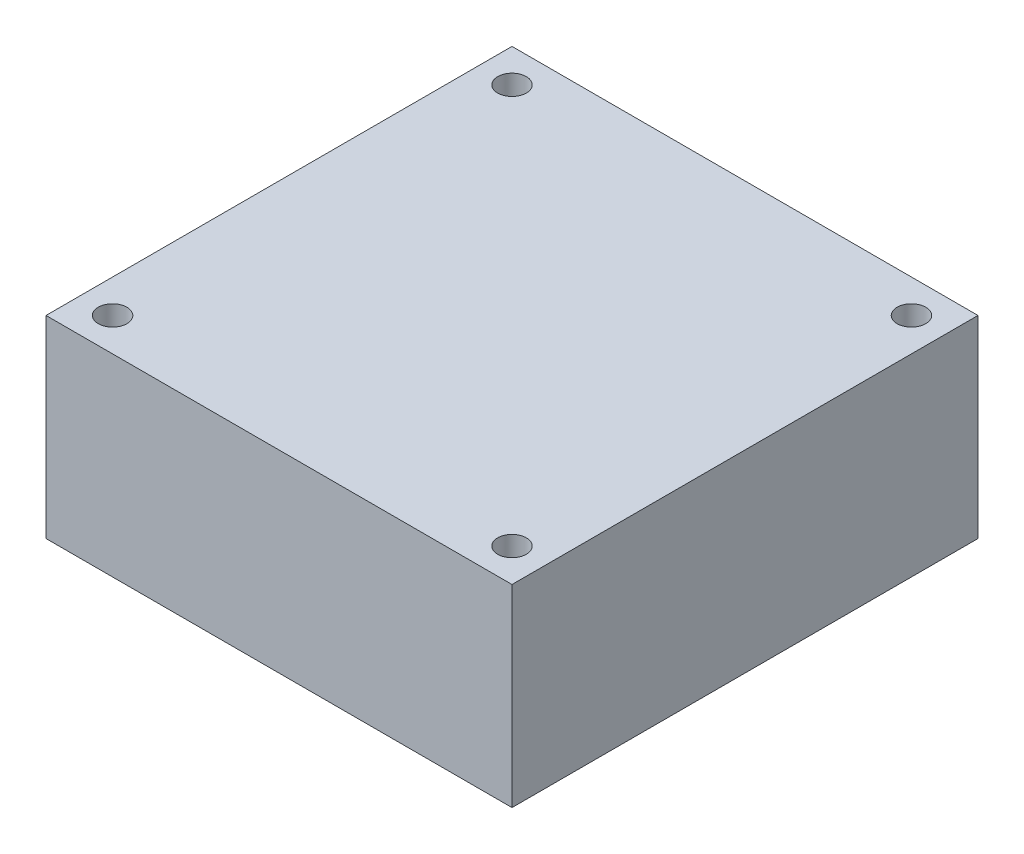
ISO-10303-21;
HEADER;
FILE_DESCRIPTION(('STEP AP214'),'2;1');
FILE_NAME('part.step','',(''),(''),'','','');
FILE_SCHEMA(('AUTOMOTIVE_DESIGN { 1 0 10303 214 1 1 1 1 }'));
ENDSEC;
DATA;
#1=APPLICATION_CONTEXT('core data for automotive mechanical design processes');
#2=APPLICATION_PROTOCOL_DEFINITION('international standard','automotive_design',2000,#1);
#3=PRODUCT_CONTEXT('',#1,'mechanical');
#4=PRODUCT('Part','Part','',(#3));
#5=PRODUCT_RELATED_PRODUCT_CATEGORY('part','',(#4));
#6=PRODUCT_DEFINITION_FORMATION('','',#4);
#7=PRODUCT_DEFINITION_CONTEXT('part definition',#1,'design');
#8=PRODUCT_DEFINITION('design','',#6,#7);
#9=PRODUCT_DEFINITION_SHAPE('','',#8);
#10=(LENGTH_UNIT() NAMED_UNIT(*) SI_UNIT(.MILLI.,.METRE.));
#11=(NAMED_UNIT(*) PLANE_ANGLE_UNIT() SI_UNIT($,.RADIAN.));
#12=(NAMED_UNIT(*) SI_UNIT($,.STERADIAN.) SOLID_ANGLE_UNIT());
#13=UNCERTAINTY_MEASURE_WITH_UNIT(LENGTH_MEASURE(1.E-05),#10,'distance_accuracy_value','');
#14=(GEOMETRIC_REPRESENTATION_CONTEXT(3) GLOBAL_UNCERTAINTY_ASSIGNED_CONTEXT((#13)) GLOBAL_UNIT_ASSIGNED_CONTEXT((#10,
#11,#12)) REPRESENTATION_CONTEXT('',''));
#15=CARTESIAN_POINT('',(0.,0.,0.));
#16=DIRECTION('',(0.,0.,1.));
#17=DIRECTION('',(1.,0.,0.));
#18=AXIS2_PLACEMENT_3D('',#15,#16,#17);
#19=CARTESIAN_POINT('',(0.,29.025,0.));
#20=DIRECTION('',(0.,-1.,0.));
#21=DIRECTION('',(0.,0.,-1.));
#22=AXIS2_PLACEMENT_3D('',#19,#20,#21);
#23=PLANE('',#22);
#24=DIRECTION('',(0.,0.,-1.));
#25=VECTOR('',#24,1.);
#26=CARTESIAN_POINT('',(35.,29.025,35.));
#27=LINE('',#26,#25);
#28=CARTESIAN_POINT('',(35.,29.025,35.));
#29=VERTEX_POINT('',#28);
#30=CARTESIAN_POINT('',(35.,29.025,-35.));
#31=VERTEX_POINT('',#30);
#32=EDGE_CURVE('E98',#29,#31,#27,.T.);
#33=ORIENTED_EDGE('',*,*,#32,.T.);
#34=DIRECTION('',(-1.,0.,0.));
#35=VECTOR('',#34,1.);
#36=CARTESIAN_POINT('',(-35.,29.025,-35.));
#37=LINE('',#36,#35);
#38=CARTESIAN_POINT('',(-35.,29.025,-35.));
#39=VERTEX_POINT('',#38);
#40=EDGE_CURVE('E93',#31,#39,#37,.T.);
#41=ORIENTED_EDGE('',*,*,#40,.T.);
#42=DIRECTION('',(0.,0.,1.));
#43=VECTOR('',#42,1.);
#44=CARTESIAN_POINT('',(-35.,29.025,35.));
#45=LINE('',#44,#43);
#46=CARTESIAN_POINT('',(-35.,29.025,35.));
#47=VERTEX_POINT('',#46);
#48=EDGE_CURVE('E96',#39,#47,#45,.T.);
#49=ORIENTED_EDGE('',*,*,#48,.T.);
#50=DIRECTION('',(1.,0.,0.));
#51=VECTOR('',#50,1.);
#52=CARTESIAN_POINT('',(-35.,29.025,35.));
#53=LINE('',#52,#51);
#54=EDGE_CURVE('E63',#47,#29,#53,.T.);
#55=ORIENTED_EDGE('',*,*,#54,.T.);
#56=EDGE_LOOP('',(#33,#41,#49,#55));
#57=FACE_BOUND('',#56,.T.);
#58=CARTESIAN_POINT('',(30.,29.025,-30.));
#59=DIRECTION('',(0.,1.,0.));
#60=DIRECTION('',(0.,0.,1.));
#61=AXIS2_PLACEMENT_3D('',#58,#59,#60);
#62=CIRCLE('',#61,2.15);
#63=CARTESIAN_POINT('',(30.,29.025,-32.15));
#64=VERTEX_POINT('',#63);
#65=EDGE_CURVE('E118',#64,#64,#62,.T.);
#66=ORIENTED_EDGE('',*,*,#65,.F.);
#67=EDGE_LOOP('',(#66));
#68=FACE_BOUND('',#67,.T.);
#69=CARTESIAN_POINT('',(-30.,29.025,-30.));
#70=DIRECTION('',(0.,1.,0.));
#71=DIRECTION('',(0.,0.,-1.));
#72=AXIS2_PLACEMENT_3D('',#69,#70,#71);
#73=CIRCLE('',#72,2.15);
#74=CARTESIAN_POINT('',(-30.,29.025,-32.15));
#75=VERTEX_POINT('',#74);
#76=EDGE_CURVE('E140',#75,#75,#73,.T.);
#77=ORIENTED_EDGE('',*,*,#76,.F.);
#78=EDGE_LOOP('',(#77));
#79=FACE_BOUND('',#78,.T.);
#80=CARTESIAN_POINT('',(-30.,29.025,30.));
#81=DIRECTION('',(0.,1.,0.));
#82=DIRECTION('',(0.,0.,1.));
#83=AXIS2_PLACEMENT_3D('',#80,#81,#82);
#84=CIRCLE('',#83,2.15);
#85=CARTESIAN_POINT('',(-30.,29.025,27.85));
#86=VERTEX_POINT('',#85);
#87=EDGE_CURVE('E148',#86,#86,#84,.T.);
#88=ORIENTED_EDGE('',*,*,#87,.F.);
#89=EDGE_LOOP('',(#88));
#90=FACE_BOUND('',#89,.T.);
#91=CARTESIAN_POINT('',(30.,29.025,30.));
#92=DIRECTION('',(0.,1.,0.));
#93=DIRECTION('',(0.,0.,-1.));
#94=AXIS2_PLACEMENT_3D('',#91,#92,#93);
#95=CIRCLE('',#94,2.15000000000001);
#96=CARTESIAN_POINT('',(30.,29.025,27.85));
#97=VERTEX_POINT('',#96);
#98=EDGE_CURVE('E156',#97,#97,#95,.T.);
#99=ORIENTED_EDGE('',*,*,#98,.F.);
#100=EDGE_LOOP('',(#99));
#101=FACE_BOUND('',#100,.T.);
#102=ADVANCED_FACE('F45',(#57,#68,#79,#90,#101),#23,.F.);
#103=CARTESIAN_POINT('',(0.,0.,0.));
#104=DIRECTION('',(0.,-1.,0.));
#105=DIRECTION('',(0.,0.,-1.));
#106=AXIS2_PLACEMENT_3D('',#103,#104,#105);
#107=PLANE('',#106);
#108=CARTESIAN_POINT('',(-30.,0.,30.));
#109=DIRECTION('',(0.,1.,0.));
#110=DIRECTION('',(0.,0.,1.));
#111=AXIS2_PLACEMENT_3D('',#108,#109,#110);
#112=CIRCLE('',#111,2.15);
#113=CARTESIAN_POINT('',(-30.,0.,27.85));
#114=VERTEX_POINT('',#113);
#115=EDGE_CURVE('E152',#114,#114,#112,.T.);
#116=ORIENTED_EDGE('',*,*,#115,.T.);
#117=EDGE_LOOP('',(#116));
#118=FACE_BOUND('',#117,.T.);
#119=CARTESIAN_POINT('',(30.,0.,-30.));
#120=DIRECTION('',(0.,1.,0.));
#121=DIRECTION('',(0.,0.,1.));
#122=AXIS2_PLACEMENT_3D('',#119,#120,#121);
#123=CIRCLE('',#122,2.15);
#124=CARTESIAN_POINT('',(30.,0.,-32.15));
#125=VERTEX_POINT('',#124);
#126=EDGE_CURVE('E136',#125,#125,#123,.T.);
#127=ORIENTED_EDGE('',*,*,#126,.T.);
#128=EDGE_LOOP('',(#127));
#129=FACE_BOUND('',#128,.T.);
#130=DIRECTION('',(0.,0.,-1.));
#131=VECTOR('',#130,1.);
#132=CARTESIAN_POINT('',(35.,0.,35.));
#133=LINE('',#132,#131);
#134=CARTESIAN_POINT('',(35.,0.,35.));
#135=VERTEX_POINT('',#134);
#136=CARTESIAN_POINT('',(35.,0.,-35.));
#137=VERTEX_POINT('',#136);
#138=EDGE_CURVE('E114',#135,#137,#133,.T.);
#139=ORIENTED_EDGE('',*,*,#138,.F.);
#140=DIRECTION('',(1.,0.,0.));
#141=VECTOR('',#140,1.);
#142=CARTESIAN_POINT('',(-35.,0.,35.));
#143=LINE('',#142,#141);
#144=CARTESIAN_POINT('',(-35.,0.,35.));
#145=VERTEX_POINT('',#144);
#146=EDGE_CURVE('E86',#145,#135,#143,.T.);
#147=ORIENTED_EDGE('',*,*,#146,.F.);
#148=DIRECTION('',(0.,0.,1.));
#149=VECTOR('',#148,1.);
#150=CARTESIAN_POINT('',(-35.,0.,35.));
#151=LINE('',#150,#149);
#152=CARTESIAN_POINT('',(-35.,0.,-35.));
#153=VERTEX_POINT('',#152);
#154=EDGE_CURVE('E80',#153,#145,#151,.T.);
#155=ORIENTED_EDGE('',*,*,#154,.F.);
#156=DIRECTION('',(-1.,0.,0.));
#157=VECTOR('',#156,1.);
#158=CARTESIAN_POINT('',(-35.,0.,-35.));
#159=LINE('',#158,#157);
#160=EDGE_CURVE('E103',#137,#153,#159,.T.);
#161=ORIENTED_EDGE('',*,*,#160,.F.);
#162=EDGE_LOOP('',(#139,#147,#155,#161));
#163=FACE_BOUND('',#162,.T.);
#164=CARTESIAN_POINT('',(-30.,0.,-30.));
#165=DIRECTION('',(0.,1.,0.));
#166=DIRECTION('',(0.,0.,-1.));
#167=AXIS2_PLACEMENT_3D('',#164,#165,#166);
#168=CIRCLE('',#167,2.15);
#169=CARTESIAN_POINT('',(-30.,0.,-32.15));
#170=VERTEX_POINT('',#169);
#171=EDGE_CURVE('E144',#170,#170,#168,.T.);
#172=ORIENTED_EDGE('',*,*,#171,.T.);
#173=EDGE_LOOP('',(#172));
#174=FACE_BOUND('',#173,.T.);
#175=CARTESIAN_POINT('',(30.,0.,30.));
#176=DIRECTION('',(0.,1.,0.));
#177=DIRECTION('',(0.,0.,-1.));
#178=AXIS2_PLACEMENT_3D('',#175,#176,#177);
#179=CIRCLE('',#178,2.15000000000001);
#180=CARTESIAN_POINT('',(30.,0.,27.85));
#181=VERTEX_POINT('',#180);
#182=EDGE_CURVE('E160',#181,#181,#179,.T.);
#183=ORIENTED_EDGE('',*,*,#182,.T.);
#184=EDGE_LOOP('',(#183));
#185=FACE_BOUND('',#184,.T.);
#186=ADVANCED_FACE('F131',(#118,#129,#163,#174,#185),#107,.T.);
#187=CARTESIAN_POINT('',(35.,29.025,35.));
#188=DIRECTION('',(-1.,0.,0.));
#189=DIRECTION('',(0.,0.,1.));
#190=AXIS2_PLACEMENT_3D('',#187,#188,#189);
#191=PLANE('',#190);
#192=ORIENTED_EDGE('',*,*,#138,.T.);
#193=DIRECTION('',(0.,-1.,0.));
#194=VECTOR('',#193,1.);
#195=CARTESIAN_POINT('',(35.,29.025,-35.));
#196=LINE('',#195,#194);
#197=EDGE_CURVE('E11',#31,#137,#196,.T.);
#198=ORIENTED_EDGE('',*,*,#197,.F.);
#199=ORIENTED_EDGE('',*,*,#32,.F.);
#200=DIRECTION('',(0.,-1.,0.));
#201=VECTOR('',#200,1.);
#202=CARTESIAN_POINT('',(35.,29.025,35.));
#203=LINE('',#202,#201);
#204=EDGE_CURVE('E110',#29,#135,#203,.T.);
#205=ORIENTED_EDGE('',*,*,#204,.T.);
#206=EDGE_LOOP('',(#192,#198,#199,#205));
#207=FACE_BOUND('',#206,.T.);
#208=ADVANCED_FACE('F47',(#207),#191,.F.);
#209=CARTESIAN_POINT('',(-35.,29.025,-35.));
#210=DIRECTION('',(0.,0.,1.));
#211=DIRECTION('',(1.,0.,0.));
#212=AXIS2_PLACEMENT_3D('',#209,#210,#211);
#213=PLANE('',#212);
#214=ORIENTED_EDGE('',*,*,#160,.T.);
#215=DIRECTION('',(0.,-1.,0.));
#216=VECTOR('',#215,1.);
#217=CARTESIAN_POINT('',(-35.,29.025,-35.));
#218=LINE('',#217,#216);
#219=EDGE_CURVE('E55',#39,#153,#218,.T.);
#220=ORIENTED_EDGE('',*,*,#219,.F.);
#221=ORIENTED_EDGE('',*,*,#40,.F.);
#222=ORIENTED_EDGE('',*,*,#197,.T.);
#223=EDGE_LOOP('',(#214,#220,#221,#222));
#224=FACE_BOUND('',#223,.T.);
#225=ADVANCED_FACE('F102',(#224),#213,.F.);
#226=CARTESIAN_POINT('',(-35.,29.025,35.));
#227=DIRECTION('',(1.,0.,0.));
#228=DIRECTION('',(0.,0.,-1.));
#229=AXIS2_PLACEMENT_3D('',#226,#227,#228);
#230=PLANE('',#229);
#231=ORIENTED_EDGE('',*,*,#154,.T.);
#232=DIRECTION('',(0.,-1.,0.));
#233=VECTOR('',#232,1.);
#234=CARTESIAN_POINT('',(-35.,29.025,35.));
#235=LINE('',#234,#233);
#236=EDGE_CURVE('E105',#47,#145,#235,.T.);
#237=ORIENTED_EDGE('',*,*,#236,.F.);
#238=ORIENTED_EDGE('',*,*,#48,.F.);
#239=ORIENTED_EDGE('',*,*,#219,.T.);
#240=EDGE_LOOP('',(#231,#237,#238,#239));
#241=FACE_BOUND('',#240,.T.);
#242=ADVANCED_FACE('F106',(#241),#230,.F.);
#243=CARTESIAN_POINT('',(-35.,29.025,35.));
#244=DIRECTION('',(0.,0.,-1.));
#245=DIRECTION('',(-1.,0.,0.));
#246=AXIS2_PLACEMENT_3D('',#243,#244,#245);
#247=PLANE('',#246);
#248=ORIENTED_EDGE('',*,*,#146,.T.);
#249=ORIENTED_EDGE('',*,*,#204,.F.);
#250=ORIENTED_EDGE('',*,*,#54,.F.);
#251=ORIENTED_EDGE('',*,*,#236,.T.);
#252=EDGE_LOOP('',(#248,#249,#250,#251));
#253=FACE_BOUND('',#252,.T.);
#254=ADVANCED_FACE('F128',(#253),#247,.F.);
#255=CARTESIAN_POINT('',(30.,29.025,-30.));
#256=DIRECTION('',(0.,-1.,0.));
#257=DIRECTION('',(0.,0.,-1.));
#258=AXIS2_PLACEMENT_3D('',#255,#256,#257);
#259=CYLINDRICAL_SURFACE('',#258,2.15);
#260=CARTESIAN_POINT('',(30.,29.025,-32.15));
#261=CARTESIAN_POINT('',(30.,28.72265625,-32.15));
#262=CARTESIAN_POINT('',(30.,28.4203125,-32.15));
#263=CARTESIAN_POINT('',(30.,27.815625,-32.15));
#264=CARTESIAN_POINT('',(30.,27.51328125,-32.15));
#265=CARTESIAN_POINT('',(30.,26.90859375,-32.15));
#266=CARTESIAN_POINT('',(30.,26.60625,-32.15));
#267=CARTESIAN_POINT('',(30.,26.0015625,-32.15));
#268=CARTESIAN_POINT('',(30.,25.69921875,-32.15));
#269=CARTESIAN_POINT('',(30.,25.09453125,-32.15));
#270=CARTESIAN_POINT('',(30.,24.7921875,-32.15));
#271=CARTESIAN_POINT('',(30.,24.1875,-32.15));
#272=CARTESIAN_POINT('',(30.,23.88515625,-32.15));
#273=CARTESIAN_POINT('',(30.,23.28046875,-32.15));
#274=CARTESIAN_POINT('',(30.,22.978125,-32.15));
#275=CARTESIAN_POINT('',(30.,22.3734375,-32.15));
#276=CARTESIAN_POINT('',(30.,22.07109375,-32.15));
#277=CARTESIAN_POINT('',(30.,21.46640625,-32.15));
#278=CARTESIAN_POINT('',(30.,21.1640625,-32.15));
#279=CARTESIAN_POINT('',(30.,20.559375,-32.15));
#280=CARTESIAN_POINT('',(30.,20.25703125,-32.15));
#281=CARTESIAN_POINT('',(30.,19.65234375,-32.15));
#282=CARTESIAN_POINT('',(30.,19.35,-32.15));
#283=CARTESIAN_POINT('',(30.,18.7453125,-32.15));
#284=CARTESIAN_POINT('',(30.,18.44296875,-32.15));
#285=CARTESIAN_POINT('',(30.,17.83828125,-32.15));
#286=CARTESIAN_POINT('',(30.,17.5359375,-32.15));
#287=CARTESIAN_POINT('',(30.,16.93125,-32.15));
#288=CARTESIAN_POINT('',(30.,16.62890625,-32.15));
#289=CARTESIAN_POINT('',(30.,16.02421875,-32.15));
#290=CARTESIAN_POINT('',(30.,15.721875,-32.15));
#291=CARTESIAN_POINT('',(30.,15.1171875,-32.15));
#292=CARTESIAN_POINT('',(30.,14.81484375,-32.15));
#293=CARTESIAN_POINT('',(30.,14.21015625,-32.15));
#294=CARTESIAN_POINT('',(30.,13.9078125,-32.15));
#295=CARTESIAN_POINT('',(30.,13.303125,-32.15));
#296=CARTESIAN_POINT('',(30.,13.00078125,-32.15));
#297=CARTESIAN_POINT('',(30.,12.39609375,-32.15));
#298=CARTESIAN_POINT('',(30.,12.09375,-32.15));
#299=CARTESIAN_POINT('',(30.,11.4890625,-32.15));
#300=CARTESIAN_POINT('',(30.,11.18671875,-32.15));
#301=CARTESIAN_POINT('',(30.,10.58203125,-32.15));
#302=CARTESIAN_POINT('',(30.,10.2796875,-32.15));
#303=CARTESIAN_POINT('',(30.,9.675,-32.15));
#304=CARTESIAN_POINT('',(30.,9.37265625,-32.15));
#305=CARTESIAN_POINT('',(30.,8.76796875,-32.15));
#306=CARTESIAN_POINT('',(30.,8.465625,-32.15));
#307=CARTESIAN_POINT('',(30.,7.8609375,-32.15));
#308=CARTESIAN_POINT('',(30.,7.55859375,-32.15));
#309=CARTESIAN_POINT('',(30.,6.95390625,-32.15));
#310=CARTESIAN_POINT('',(30.,6.6515625,-32.15));
#311=CARTESIAN_POINT('',(30.,6.046875,-32.15));
#312=CARTESIAN_POINT('',(30.,5.74453125,-32.15));
#313=CARTESIAN_POINT('',(30.,5.13984375,-32.15));
#314=CARTESIAN_POINT('',(30.,4.8375,-32.15));
#315=CARTESIAN_POINT('',(30.,4.2328125,-32.15));
#316=CARTESIAN_POINT('',(30.,3.93046875,-32.15));
#317=CARTESIAN_POINT('',(30.,3.32578125,-32.15));
#318=CARTESIAN_POINT('',(30.,3.0234375,-32.15));
#319=CARTESIAN_POINT('',(30.,2.41875,-32.15));
#320=CARTESIAN_POINT('',(30.,2.11640625,-32.15));
#321=CARTESIAN_POINT('',(30.,1.51171875,-32.15));
#322=CARTESIAN_POINT('',(30.,1.209375,-32.15));
#323=CARTESIAN_POINT('',(30.,0.604687499999999,-32.15));
#324=CARTESIAN_POINT('',(30.,0.302343749999999,-32.15));
#325=CARTESIAN_POINT('',(30.,0.,-32.15));
#326=B_SPLINE_CURVE_WITH_KNOTS('',3,(#260,#261,#262,#263,#264,#265,#266,#267,#268,#269,#270,
#271,#272,#273,#274,#275,#276,#277,#278,#279,#280,#281,#282,#283,#284,#285,#286,#287,#288,#289,
#290,#291,#292,#293,#294,#295,#296,#297,#298,#299,#300,#301,#302,#303,#304,#305,#306,#307,#308,
#309,#310,#311,#312,#313,#314,#315,#316,#317,#318,#319,#320,#321,#322,#323,#324,#325),
.UNSPECIFIED.,.F.,.F.,(4,2,2,2,2,2,2,2,2,2,2,2,2,2,2,2,2,2,2,2,2,2,2,2,2,2,2,2,2,2,2,2,4),(0.,
0.907031249999999,1.8140625,2.72109375,3.628125,4.53515625,5.4421875,6.34921875,7.25625,
8.16328124999999,9.0703125,9.97734375,10.884375,11.79140625,12.6984375,13.60546875,14.5125,
15.41953125,16.3265625,17.23359375,18.140625,19.04765625,19.9546875,20.86171875,21.76875,
22.67578125,23.5828125,24.48984375,25.396875,26.30390625,27.2109375,28.11796875,29.025),.UNSPECIFIED.);
#327=EDGE_CURVE('BSEAM179',#64,#125,#326,.T.);
#328=ORIENTED_EDGE('',*,*,#65,.T.);
#329=ORIENTED_EDGE('',*,*,#126,.F.);
#330=ORIENTED_EDGE('',*,*,#327,.T.);
#331=ORIENTED_EDGE('',*,*,#327,.F.);
#332=EDGE_LOOP('',(#328,#330,#329,#331));
#333=FACE_BOUND('',#332,.T.);
#334=ADVANCED_FACE('F179',(#333),#259,.F.);
#335=CARTESIAN_POINT('',(-30.,29.025,-30.));
#336=DIRECTION('',(0.,-1.,0.));
#337=DIRECTION('',(0.,0.,-1.));
#338=AXIS2_PLACEMENT_3D('',#335,#336,#337);
#339=CYLINDRICAL_SURFACE('',#338,2.15);
#340=CARTESIAN_POINT('',(-30.,29.025,-32.15));
#341=CARTESIAN_POINT('',(-30.,28.72265625,-32.15));
#342=CARTESIAN_POINT('',(-30.,28.4203125,-32.15));
#343=CARTESIAN_POINT('',(-30.,27.815625,-32.15));
#344=CARTESIAN_POINT('',(-30.,27.51328125,-32.15));
#345=CARTESIAN_POINT('',(-30.,26.90859375,-32.15));
#346=CARTESIAN_POINT('',(-30.,26.60625,-32.15));
#347=CARTESIAN_POINT('',(-30.,26.0015625,-32.15));
#348=CARTESIAN_POINT('',(-30.,25.69921875,-32.15));
#349=CARTESIAN_POINT('',(-30.,25.09453125,-32.15));
#350=CARTESIAN_POINT('',(-30.,24.7921875,-32.15));
#351=CARTESIAN_POINT('',(-30.,24.1875,-32.15));
#352=CARTESIAN_POINT('',(-30.,23.88515625,-32.15));
#353=CARTESIAN_POINT('',(-30.,23.28046875,-32.15));
#354=CARTESIAN_POINT('',(-30.,22.978125,-32.15));
#355=CARTESIAN_POINT('',(-30.,22.3734375,-32.15));
#356=CARTESIAN_POINT('',(-30.,22.07109375,-32.15));
#357=CARTESIAN_POINT('',(-30.,21.46640625,-32.15));
#358=CARTESIAN_POINT('',(-30.,21.1640625,-32.15));
#359=CARTESIAN_POINT('',(-30.,20.559375,-32.15));
#360=CARTESIAN_POINT('',(-30.,20.25703125,-32.15));
#361=CARTESIAN_POINT('',(-30.,19.65234375,-32.15));
#362=CARTESIAN_POINT('',(-30.,19.35,-32.15));
#363=CARTESIAN_POINT('',(-30.,18.7453125,-32.15));
#364=CARTESIAN_POINT('',(-30.,18.44296875,-32.15));
#365=CARTESIAN_POINT('',(-30.,17.83828125,-32.15));
#366=CARTESIAN_POINT('',(-30.,17.5359375,-32.15));
#367=CARTESIAN_POINT('',(-30.,16.93125,-32.15));
#368=CARTESIAN_POINT('',(-30.,16.62890625,-32.15));
#369=CARTESIAN_POINT('',(-30.,16.02421875,-32.15));
#370=CARTESIAN_POINT('',(-30.,15.721875,-32.15));
#371=CARTESIAN_POINT('',(-30.,15.1171875,-32.15));
#372=CARTESIAN_POINT('',(-30.,14.81484375,-32.15));
#373=CARTESIAN_POINT('',(-30.,14.21015625,-32.15));
#374=CARTESIAN_POINT('',(-30.,13.9078125,-32.15));
#375=CARTESIAN_POINT('',(-30.,13.303125,-32.15));
#376=CARTESIAN_POINT('',(-30.,13.00078125,-32.15));
#377=CARTESIAN_POINT('',(-30.,12.39609375,-32.15));
#378=CARTESIAN_POINT('',(-30.,12.09375,-32.15));
#379=CARTESIAN_POINT('',(-30.,11.4890625,-32.15));
#380=CARTESIAN_POINT('',(-30.,11.18671875,-32.15));
#381=CARTESIAN_POINT('',(-30.,10.58203125,-32.15));
#382=CARTESIAN_POINT('',(-30.,10.2796875,-32.15));
#383=CARTESIAN_POINT('',(-30.,9.675,-32.15));
#384=CARTESIAN_POINT('',(-30.,9.37265625,-32.15));
#385=CARTESIAN_POINT('',(-30.,8.76796875,-32.15));
#386=CARTESIAN_POINT('',(-30.,8.465625,-32.15));
#387=CARTESIAN_POINT('',(-30.,7.8609375,-32.15));
#388=CARTESIAN_POINT('',(-30.,7.55859375,-32.15));
#389=CARTESIAN_POINT('',(-30.,6.95390625,-32.15));
#390=CARTESIAN_POINT('',(-30.,6.6515625,-32.15));
#391=CARTESIAN_POINT('',(-30.,6.046875,-32.15));
#392=CARTESIAN_POINT('',(-30.,5.74453125,-32.15));
#393=CARTESIAN_POINT('',(-30.,5.13984375,-32.15));
#394=CARTESIAN_POINT('',(-30.,4.8375,-32.15));
#395=CARTESIAN_POINT('',(-30.,4.2328125,-32.15));
#396=CARTESIAN_POINT('',(-30.,3.93046875,-32.15));
#397=CARTESIAN_POINT('',(-30.,3.32578125,-32.15));
#398=CARTESIAN_POINT('',(-30.,3.0234375,-32.15));
#399=CARTESIAN_POINT('',(-30.,2.41875,-32.15));
#400=CARTESIAN_POINT('',(-30.,2.11640625,-32.15));
#401=CARTESIAN_POINT('',(-30.,1.51171875,-32.15));
#402=CARTESIAN_POINT('',(-30.,1.209375,-32.15));
#403=CARTESIAN_POINT('',(-30.,0.604687499999999,-32.15));
#404=CARTESIAN_POINT('',(-30.,0.302343749999999,-32.15));
#405=CARTESIAN_POINT('',(-30.,0.,-32.15));
#406=B_SPLINE_CURVE_WITH_KNOTS('',3,(#340,#341,#342,#343,#344,#345,#346,#347,#348,#349,#350,
#351,#352,#353,#354,#355,#356,#357,#358,#359,#360,#361,#362,#363,#364,#365,#366,#367,#368,#369,
#370,#371,#372,#373,#374,#375,#376,#377,#378,#379,#380,#381,#382,#383,#384,#385,#386,#387,#388,
#389,#390,#391,#392,#393,#394,#395,#396,#397,#398,#399,#400,#401,#402,#403,#404,#405),
.UNSPECIFIED.,.F.,.F.,(4,2,2,2,2,2,2,2,2,2,2,2,2,2,2,2,2,2,2,2,2,2,2,2,2,2,2,2,2,2,2,2,4),(0.,
0.907031249999999,1.8140625,2.72109375,3.628125,4.53515625,5.4421875,6.34921875,7.25625,
8.16328124999999,9.0703125,9.97734375,10.884375,11.79140625,12.6984375,13.60546875,14.5125,
15.41953125,16.3265625,17.23359375,18.140625,19.04765625,19.9546875,20.86171875,21.76875,
22.67578125,23.5828125,24.48984375,25.396875,26.30390625,27.2109375,28.11796875,29.025),.UNSPECIFIED.);
#407=EDGE_CURVE('BSEAM224',#75,#170,#406,.T.);
#408=ORIENTED_EDGE('',*,*,#76,.T.);
#409=ORIENTED_EDGE('',*,*,#171,.F.);
#410=ORIENTED_EDGE('',*,*,#407,.T.);
#411=ORIENTED_EDGE('',*,*,#407,.F.);
#412=EDGE_LOOP('',(#408,#410,#409,#411));
#413=FACE_BOUND('',#412,.T.);
#414=ADVANCED_FACE('F224',(#413),#339,.F.);
#415=CARTESIAN_POINT('',(-30.,29.025,30.));
#416=DIRECTION('',(0.,-1.,0.));
#417=DIRECTION('',(0.,0.,-1.));
#418=AXIS2_PLACEMENT_3D('',#415,#416,#417);
#419=CYLINDRICAL_SURFACE('',#418,2.15);
#420=CARTESIAN_POINT('',(-30.,29.025,27.85));
#421=CARTESIAN_POINT('',(-30.,28.72265625,27.85));
#422=CARTESIAN_POINT('',(-30.,28.4203125,27.85));
#423=CARTESIAN_POINT('',(-30.,27.815625,27.85));
#424=CARTESIAN_POINT('',(-30.,27.51328125,27.85));
#425=CARTESIAN_POINT('',(-30.,26.90859375,27.85));
#426=CARTESIAN_POINT('',(-30.,26.60625,27.85));
#427=CARTESIAN_POINT('',(-30.,26.0015625,27.85));
#428=CARTESIAN_POINT('',(-30.,25.69921875,27.85));
#429=CARTESIAN_POINT('',(-30.,25.09453125,27.85));
#430=CARTESIAN_POINT('',(-30.,24.7921875,27.85));
#431=CARTESIAN_POINT('',(-30.,24.1875,27.85));
#432=CARTESIAN_POINT('',(-30.,23.88515625,27.85));
#433=CARTESIAN_POINT('',(-30.,23.28046875,27.85));
#434=CARTESIAN_POINT('',(-30.,22.978125,27.85));
#435=CARTESIAN_POINT('',(-30.,22.3734375,27.85));
#436=CARTESIAN_POINT('',(-30.,22.07109375,27.85));
#437=CARTESIAN_POINT('',(-30.,21.46640625,27.85));
#438=CARTESIAN_POINT('',(-30.,21.1640625,27.85));
#439=CARTESIAN_POINT('',(-30.,20.559375,27.85));
#440=CARTESIAN_POINT('',(-30.,20.25703125,27.85));
#441=CARTESIAN_POINT('',(-30.,19.65234375,27.85));
#442=CARTESIAN_POINT('',(-30.,19.35,27.85));
#443=CARTESIAN_POINT('',(-30.,18.7453125,27.85));
#444=CARTESIAN_POINT('',(-30.,18.44296875,27.85));
#445=CARTESIAN_POINT('',(-30.,17.83828125,27.85));
#446=CARTESIAN_POINT('',(-30.,17.5359375,27.85));
#447=CARTESIAN_POINT('',(-30.,16.93125,27.85));
#448=CARTESIAN_POINT('',(-30.,16.62890625,27.85));
#449=CARTESIAN_POINT('',(-30.,16.02421875,27.85));
#450=CARTESIAN_POINT('',(-30.,15.721875,27.85));
#451=CARTESIAN_POINT('',(-30.,15.1171875,27.85));
#452=CARTESIAN_POINT('',(-30.,14.81484375,27.85));
#453=CARTESIAN_POINT('',(-30.,14.21015625,27.85));
#454=CARTESIAN_POINT('',(-30.,13.9078125,27.85));
#455=CARTESIAN_POINT('',(-30.,13.303125,27.85));
#456=CARTESIAN_POINT('',(-30.,13.00078125,27.85));
#457=CARTESIAN_POINT('',(-30.,12.39609375,27.85));
#458=CARTESIAN_POINT('',(-30.,12.09375,27.85));
#459=CARTESIAN_POINT('',(-30.,11.4890625,27.85));
#460=CARTESIAN_POINT('',(-30.,11.18671875,27.85));
#461=CARTESIAN_POINT('',(-30.,10.58203125,27.85));
#462=CARTESIAN_POINT('',(-30.,10.2796875,27.85));
#463=CARTESIAN_POINT('',(-30.,9.675,27.85));
#464=CARTESIAN_POINT('',(-30.,9.37265625,27.85));
#465=CARTESIAN_POINT('',(-30.,8.76796875,27.85));
#466=CARTESIAN_POINT('',(-30.,8.465625,27.85));
#467=CARTESIAN_POINT('',(-30.,7.8609375,27.85));
#468=CARTESIAN_POINT('',(-30.,7.55859375,27.85));
#469=CARTESIAN_POINT('',(-30.,6.95390625,27.85));
#470=CARTESIAN_POINT('',(-30.,6.6515625,27.85));
#471=CARTESIAN_POINT('',(-30.,6.046875,27.85));
#472=CARTESIAN_POINT('',(-30.,5.74453125,27.85));
#473=CARTESIAN_POINT('',(-30.,5.13984375,27.85));
#474=CARTESIAN_POINT('',(-30.,4.8375,27.85));
#475=CARTESIAN_POINT('',(-30.,4.2328125,27.85));
#476=CARTESIAN_POINT('',(-30.,3.93046875,27.85));
#477=CARTESIAN_POINT('',(-30.,3.32578125,27.85));
#478=CARTESIAN_POINT('',(-30.,3.0234375,27.85));
#479=CARTESIAN_POINT('',(-30.,2.41875,27.85));
#480=CARTESIAN_POINT('',(-30.,2.11640625,27.85));
#481=CARTESIAN_POINT('',(-30.,1.51171875,27.85));
#482=CARTESIAN_POINT('',(-30.,1.209375,27.85));
#483=CARTESIAN_POINT('',(-30.,0.604687499999999,27.85));
#484=CARTESIAN_POINT('',(-30.,0.302343749999999,27.85));
#485=CARTESIAN_POINT('',(-30.,0.,27.85));
#486=B_SPLINE_CURVE_WITH_KNOTS('',3,(#420,#421,#422,#423,#424,#425,#426,#427,#428,#429,#430,
#431,#432,#433,#434,#435,#436,#437,#438,#439,#440,#441,#442,#443,#444,#445,#446,#447,#448,#449,
#450,#451,#452,#453,#454,#455,#456,#457,#458,#459,#460,#461,#462,#463,#464,#465,#466,#467,#468,
#469,#470,#471,#472,#473,#474,#475,#476,#477,#478,#479,#480,#481,#482,#483,#484,#485),
.UNSPECIFIED.,.F.,.F.,(4,2,2,2,2,2,2,2,2,2,2,2,2,2,2,2,2,2,2,2,2,2,2,2,2,2,2,2,2,2,2,2,4),(0.,
0.907031249999999,1.8140625,2.72109375,3.628125,4.53515625,5.4421875,6.34921875,7.25625,
8.16328124999999,9.0703125,9.97734375,10.884375,11.79140625,12.6984375,13.60546875,14.5125,
15.41953125,16.3265625,17.23359375,18.140625,19.04765625,19.9546875,20.86171875,21.76875,
22.67578125,23.5828125,24.48984375,25.396875,26.30390625,27.2109375,28.11796875,29.025),.UNSPECIFIED.);
#487=EDGE_CURVE('BSEAM232',#86,#114,#486,.T.);
#488=ORIENTED_EDGE('',*,*,#87,.T.);
#489=ORIENTED_EDGE('',*,*,#115,.F.);
#490=ORIENTED_EDGE('',*,*,#487,.T.);
#491=ORIENTED_EDGE('',*,*,#487,.F.);
#492=EDGE_LOOP('',(#488,#490,#489,#491));
#493=FACE_BOUND('',#492,.T.);
#494=ADVANCED_FACE('F232',(#493),#419,.F.);
#495=CARTESIAN_POINT('',(30.,29.025,30.));
#496=DIRECTION('',(0.,-1.,0.));
#497=DIRECTION('',(0.,0.,-1.));
#498=AXIS2_PLACEMENT_3D('',#495,#496,#497);
#499=CYLINDRICAL_SURFACE('',#498,2.15000000000001);
#500=CARTESIAN_POINT('',(30.,29.025,27.85));
#501=CARTESIAN_POINT('',(30.,28.72265625,27.85));
#502=CARTESIAN_POINT('',(30.,28.4203125,27.85));
#503=CARTESIAN_POINT('',(30.,27.815625,27.85));
#504=CARTESIAN_POINT('',(30.,27.51328125,27.85));
#505=CARTESIAN_POINT('',(30.,26.90859375,27.85));
#506=CARTESIAN_POINT('',(30.,26.60625,27.85));
#507=CARTESIAN_POINT('',(30.,26.0015625,27.85));
#508=CARTESIAN_POINT('',(30.,25.69921875,27.85));
#509=CARTESIAN_POINT('',(30.,25.09453125,27.85));
#510=CARTESIAN_POINT('',(30.,24.7921875,27.85));
#511=CARTESIAN_POINT('',(30.,24.1875,27.85));
#512=CARTESIAN_POINT('',(30.,23.88515625,27.85));
#513=CARTESIAN_POINT('',(30.,23.28046875,27.85));
#514=CARTESIAN_POINT('',(30.,22.978125,27.85));
#515=CARTESIAN_POINT('',(30.,22.3734375,27.85));
#516=CARTESIAN_POINT('',(30.,22.07109375,27.85));
#517=CARTESIAN_POINT('',(30.,21.46640625,27.85));
#518=CARTESIAN_POINT('',(30.,21.1640625,27.85));
#519=CARTESIAN_POINT('',(30.,20.559375,27.85));
#520=CARTESIAN_POINT('',(30.,20.25703125,27.85));
#521=CARTESIAN_POINT('',(30.,19.65234375,27.85));
#522=CARTESIAN_POINT('',(30.,19.35,27.85));
#523=CARTESIAN_POINT('',(30.,18.7453125,27.85));
#524=CARTESIAN_POINT('',(30.,18.44296875,27.85));
#525=CARTESIAN_POINT('',(30.,17.83828125,27.85));
#526=CARTESIAN_POINT('',(30.,17.5359375,27.85));
#527=CARTESIAN_POINT('',(30.,16.93125,27.85));
#528=CARTESIAN_POINT('',(30.,16.62890625,27.85));
#529=CARTESIAN_POINT('',(30.,16.02421875,27.85));
#530=CARTESIAN_POINT('',(30.,15.721875,27.85));
#531=CARTESIAN_POINT('',(30.,15.1171875,27.85));
#532=CARTESIAN_POINT('',(30.,14.81484375,27.85));
#533=CARTESIAN_POINT('',(30.,14.21015625,27.85));
#534=CARTESIAN_POINT('',(30.,13.9078125,27.85));
#535=CARTESIAN_POINT('',(30.,13.303125,27.85));
#536=CARTESIAN_POINT('',(30.,13.00078125,27.85));
#537=CARTESIAN_POINT('',(30.,12.39609375,27.85));
#538=CARTESIAN_POINT('',(30.,12.09375,27.85));
#539=CARTESIAN_POINT('',(30.,11.4890625,27.85));
#540=CARTESIAN_POINT('',(30.,11.18671875,27.85));
#541=CARTESIAN_POINT('',(30.,10.58203125,27.85));
#542=CARTESIAN_POINT('',(30.,10.2796875,27.85));
#543=CARTESIAN_POINT('',(30.,9.675,27.85));
#544=CARTESIAN_POINT('',(30.,9.37265625,27.85));
#545=CARTESIAN_POINT('',(30.,8.76796875,27.85));
#546=CARTESIAN_POINT('',(30.,8.465625,27.85));
#547=CARTESIAN_POINT('',(30.,7.8609375,27.85));
#548=CARTESIAN_POINT('',(30.,7.55859375,27.85));
#549=CARTESIAN_POINT('',(30.,6.95390625,27.85));
#550=CARTESIAN_POINT('',(30.,6.6515625,27.85));
#551=CARTESIAN_POINT('',(30.,6.046875,27.85));
#552=CARTESIAN_POINT('',(30.,5.74453125,27.85));
#553=CARTESIAN_POINT('',(30.,5.13984375,27.85));
#554=CARTESIAN_POINT('',(30.,4.8375,27.85));
#555=CARTESIAN_POINT('',(30.,4.2328125,27.85));
#556=CARTESIAN_POINT('',(30.,3.93046875,27.85));
#557=CARTESIAN_POINT('',(30.,3.32578125,27.85));
#558=CARTESIAN_POINT('',(30.,3.0234375,27.85));
#559=CARTESIAN_POINT('',(30.,2.41875,27.85));
#560=CARTESIAN_POINT('',(30.,2.11640625,27.85));
#561=CARTESIAN_POINT('',(30.,1.51171875,27.85));
#562=CARTESIAN_POINT('',(30.,1.209375,27.85));
#563=CARTESIAN_POINT('',(30.,0.604687499999999,27.85));
#564=CARTESIAN_POINT('',(30.,0.302343749999999,27.85));
#565=CARTESIAN_POINT('',(30.,0.,27.85));
#566=B_SPLINE_CURVE_WITH_KNOTS('',3,(#500,#501,#502,#503,#504,#505,#506,#507,#508,#509,#510,
#511,#512,#513,#514,#515,#516,#517,#518,#519,#520,#521,#522,#523,#524,#525,#526,#527,#528,#529,
#530,#531,#532,#533,#534,#535,#536,#537,#538,#539,#540,#541,#542,#543,#544,#545,#546,#547,#548,
#549,#550,#551,#552,#553,#554,#555,#556,#557,#558,#559,#560,#561,#562,#563,#564,#565),
.UNSPECIFIED.,.F.,.F.,(4,2,2,2,2,2,2,2,2,2,2,2,2,2,2,2,2,2,2,2,2,2,2,2,2,2,2,2,2,2,2,2,4),(0.,
0.907031249999999,1.8140625,2.72109375,3.628125,4.53515625,5.4421875,6.34921875,7.25625,
8.16328124999999,9.0703125,9.97734375,10.884375,11.79140625,12.6984375,13.60546875,14.5125,
15.41953125,16.3265625,17.23359375,18.140625,19.04765625,19.9546875,20.86171875,21.76875,
22.67578125,23.5828125,24.48984375,25.396875,26.30390625,27.2109375,28.11796875,29.025),.UNSPECIFIED.);
#567=EDGE_CURVE('BSEAM168',#97,#181,#566,.T.);
#568=ORIENTED_EDGE('',*,*,#98,.T.);
#569=ORIENTED_EDGE('',*,*,#182,.F.);
#570=ORIENTED_EDGE('',*,*,#567,.T.);
#571=ORIENTED_EDGE('',*,*,#567,.F.);
#572=EDGE_LOOP('',(#568,#570,#569,#571));
#573=FACE_BOUND('',#572,.T.);
#574=ADVANCED_FACE('F168',(#573),#499,.F.);
#575=CLOSED_SHELL('',(#102,#186,#208,#225,#242,#254,#334,#414,#494,#574));
#576=MANIFOLD_SOLID_BREP('B2',#575);
#577=ADVANCED_BREP_SHAPE_REPRESENTATION('',(#18,#576),#14);
#578=SHAPE_DEFINITION_REPRESENTATION(#9,#577);
ENDSEC;
END-ISO-10303-21;
